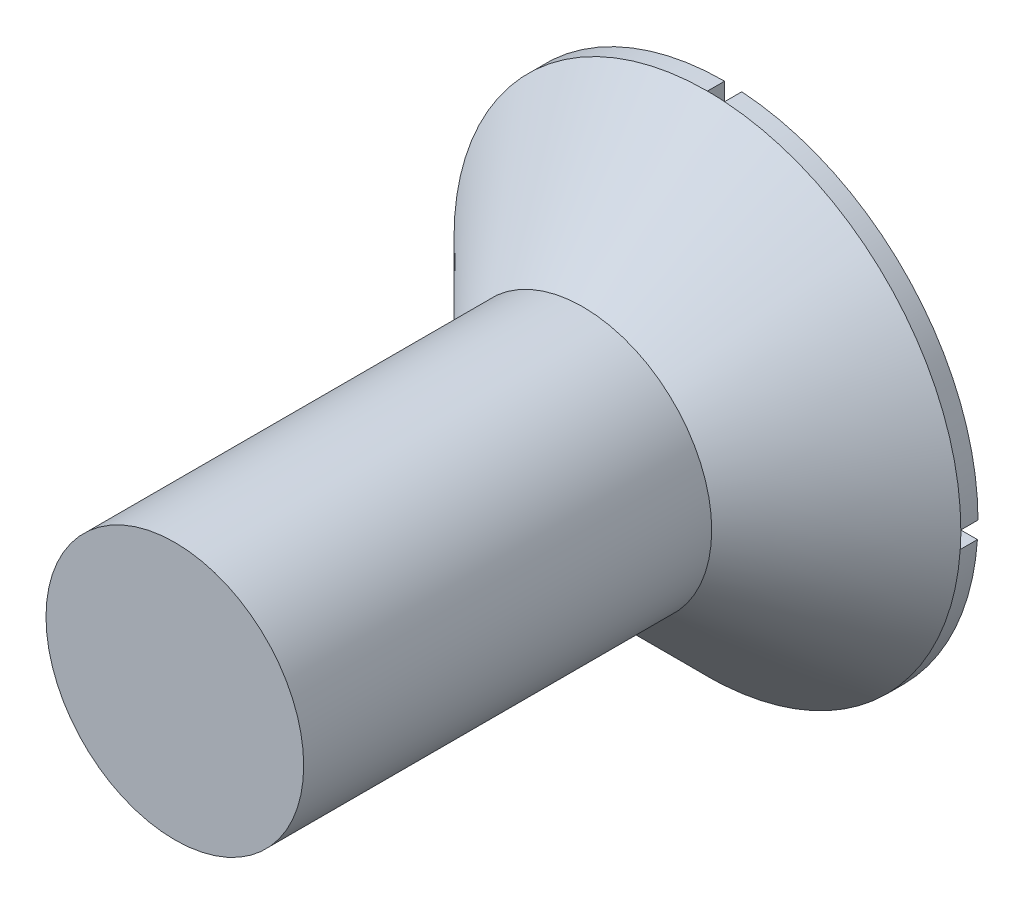
ISO-10303-21;
HEADER;
FILE_DESCRIPTION(('STEP AP214'),'2;1');
FILE_NAME('part.step','',(''),(''),'','','');
FILE_SCHEMA(('AUTOMOTIVE_DESIGN { 1 0 10303 214 1 1 1 1 }'));
ENDSEC;
DATA;
#1=APPLICATION_CONTEXT('core data for automotive mechanical design processes');
#2=APPLICATION_PROTOCOL_DEFINITION('international standard','automotive_design',2000,#1);
#3=PRODUCT_CONTEXT('',#1,'mechanical');
#4=PRODUCT('Part','Part','',(#3));
#5=PRODUCT_RELATED_PRODUCT_CATEGORY('part','',(#4));
#6=PRODUCT_DEFINITION_FORMATION('','',#4);
#7=PRODUCT_DEFINITION_CONTEXT('part definition',#1,'design');
#8=PRODUCT_DEFINITION('design','',#6,#7);
#9=PRODUCT_DEFINITION_SHAPE('','',#8);
#10=(LENGTH_UNIT() NAMED_UNIT(*) SI_UNIT(.MILLI.,.METRE.));
#11=(NAMED_UNIT(*) PLANE_ANGLE_UNIT() SI_UNIT($,.RADIAN.));
#12=(NAMED_UNIT(*) SI_UNIT($,.STERADIAN.) SOLID_ANGLE_UNIT());
#13=UNCERTAINTY_MEASURE_WITH_UNIT(LENGTH_MEASURE(1.E-05),#10,'distance_accuracy_value','');
#14=(GEOMETRIC_REPRESENTATION_CONTEXT(3) GLOBAL_UNCERTAINTY_ASSIGNED_CONTEXT((#13)) GLOBAL_UNIT_ASSIGNED_CONTEXT((#10,
#11,#12)) REPRESENTATION_CONTEXT('',''));
#15=CARTESIAN_POINT('',(0.,0.,0.));
#16=DIRECTION('',(0.,0.,1.));
#17=DIRECTION('',(1.,0.,0.));
#18=AXIS2_PLACEMENT_3D('',#15,#16,#17);
#19=CARTESIAN_POINT('',(0.,0.,-2.4));
#20=DIRECTION('',(0.,0.,1.));
#21=DIRECTION('',(1.,0.,0.));
#22=AXIS2_PLACEMENT_3D('',#19,#20,#21);
#23=CYLINDRICAL_SURFACE('',#22,2.95);
#24=DIRECTION('',(0.,0.,-1.));
#25=VECTOR('',#24,1.);
#26=CARTESIAN_POINT('',(0.,2.95,-2.2));
#27=LINE('',#26,#25);
#28=CARTESIAN_POINT('',(0.,2.95,-2.20000000000004));
#29=VERTEX_POINT('',#28);
#30=CARTESIAN_POINT('',(0.,2.95,-2.4));
#31=VERTEX_POINT('',#30);
#32=EDGE_CURVE('E197',#29,#31,#27,.T.);
#33=ORIENTED_EDGE('',*,*,#32,.T.);
#34=CARTESIAN_POINT('',(0.,0.,-2.4));
#35=DIRECTION('',(0.,0.,-1.));
#36=DIRECTION('',(-1.,0.,0.));
#37=AXIS2_PLACEMENT_3D('',#34,#35,#36);
#38=CIRCLE('',#37,2.95);
#39=CARTESIAN_POINT('',(-2.95,0.,-2.4));
#40=VERTEX_POINT('',#39);
#41=EDGE_CURVE('E174',#40,#31,#38,.T.);
#42=ORIENTED_EDGE('',*,*,#41,.F.);
#43=DIRECTION('',(0.,0.,-1.));
#44=VECTOR('',#43,1.);
#45=CARTESIAN_POINT('',(-2.95,0.,-2.2));
#46=LINE('',#45,#44);
#47=CARTESIAN_POINT('',(-2.95,0.,-2.2));
#48=VERTEX_POINT('',#47);
#49=EDGE_CURVE('E163',#48,#40,#46,.T.);
#50=ORIENTED_EDGE('',*,*,#49,.F.);
#51=CARTESIAN_POINT('',(0.,0.,-2.20000000000004));
#52=DIRECTION('',(0.,0.,-1.));
#53=DIRECTION('',(-1.,0.,0.));
#54=AXIS2_PLACEMENT_3D('',#51,#52,#53);
#55=CIRCLE('',#54,2.95);
#56=EDGE_CURVE('E65',#48,#29,#55,.T.);
#57=ORIENTED_EDGE('',*,*,#56,.T.);
#58=EDGE_LOOP('',(#33,#42,#50,#57));
#59=FACE_BOUND('',#58,.T.);
#60=ADVANCED_FACE('F57',(#59),#23,.T.);
#61=CARTESIAN_POINT('',(2.94321253055225,-0.2,-2.2));
#62=VERTEX_POINT('',#61);
#63=CARTESIAN_POINT('',(0.2,-2.94321253055225,-2.2));
#64=VERTEX_POINT('',#63);
#65=EDGE_CURVE('E254',#62,#64,#55,.T.);
#66=ORIENTED_EDGE('',*,*,#65,.T.);
#67=DIRECTION('',(0.,0.,1.));
#68=VECTOR('',#67,1.);
#69=CARTESIAN_POINT('',(0.2,-2.94321253055229,-2.4));
#70=LINE('',#69,#68);
#71=CARTESIAN_POINT('',(0.2,-2.94321253055229,-2.4));
#72=VERTEX_POINT('',#71);
#73=EDGE_CURVE('E188',#64,#72,#70,.F.);
#74=ORIENTED_EDGE('',*,*,#73,.T.);
#75=CARTESIAN_POINT('',(2.94321253055229,-0.2,-2.4));
#76=VERTEX_POINT('',#75);
#77=EDGE_CURVE('E252',#76,#72,#38,.T.);
#78=ORIENTED_EDGE('',*,*,#77,.F.);
#79=DIRECTION('',(0.,0.,1.));
#80=VECTOR('',#79,1.);
#81=CARTESIAN_POINT('',(2.94321253055229,-0.2,-2.4));
#82=LINE('',#81,#80);
#83=EDGE_CURVE('E194',#76,#62,#82,.T.);
#84=ORIENTED_EDGE('',*,*,#83,.T.);
#85=EDGE_LOOP('',(#66,#74,#78,#84));
#86=FACE_BOUND('',#85,.T.);
#87=ADVANCED_FACE('F251',(#86),#23,.T.);
#88=CARTESIAN_POINT('',(0.2,2.94321253055229,-2.4));
#89=VERTEX_POINT('',#88);
#90=CARTESIAN_POINT('',(2.95,0.,-2.4));
#91=VERTEX_POINT('',#90);
#92=EDGE_CURVE('E185',#89,#91,#38,.T.);
#93=ORIENTED_EDGE('',*,*,#92,.F.);
#94=DIRECTION('',(0.,0.,1.));
#95=VECTOR('',#94,1.);
#96=CARTESIAN_POINT('',(0.2,2.94321253055229,-2.4));
#97=LINE('',#96,#95);
#98=CARTESIAN_POINT('',(0.2,2.94321253055225,-2.2));
#99=VERTEX_POINT('',#98);
#100=EDGE_CURVE('E80',#89,#99,#97,.T.);
#101=ORIENTED_EDGE('',*,*,#100,.T.);
#102=CARTESIAN_POINT('',(2.95,0.,-2.2));
#103=VERTEX_POINT('',#102);
#104=EDGE_CURVE('E180',#99,#103,#55,.T.);
#105=ORIENTED_EDGE('',*,*,#104,.T.);
#106=DIRECTION('',(0.,0.,-1.));
#107=VECTOR('',#106,1.);
#108=CARTESIAN_POINT('',(2.95,0.,-2.2));
#109=LINE('',#108,#107);
#110=EDGE_CURVE('E175',#103,#91,#109,.T.);
#111=ORIENTED_EDGE('',*,*,#110,.T.);
#112=EDGE_LOOP('',(#93,#101,#105,#111));
#113=FACE_BOUND('',#112,.T.);
#114=ADVANCED_FACE('F277',(#113),#23,.T.);
#115=CARTESIAN_POINT('',(0.,0.,-2.4));
#116=DIRECTION('',(0.,0.,-1.));
#117=DIRECTION('',(-1.,0.,0.));
#118=AXIS2_PLACEMENT_3D('',#115,#116,#117);
#119=PLANE('',#118);
#120=ORIENTED_EDGE('',*,*,#41,.T.);
#121=DIRECTION('',(0.,-1.,0.));
#122=VECTOR('',#121,1.);
#123=CARTESIAN_POINT('',(0.,2.95,-2.4));
#124=LINE('',#123,#122);
#125=CARTESIAN_POINT('',(0.,0.,-2.4));
#126=VERTEX_POINT('',#125);
#127=EDGE_CURVE('E201',#31,#126,#124,.T.);
#128=ORIENTED_EDGE('',*,*,#127,.T.);
#129=DIRECTION('',(-1.,0.,0.));
#130=VECTOR('',#129,1.);
#131=CARTESIAN_POINT('',(2.95,0.,-2.4));
#132=LINE('',#131,#130);
#133=EDGE_CURVE('E228',#126,#40,#132,.T.);
#134=ORIENTED_EDGE('',*,*,#133,.T.);
#135=EDGE_LOOP('',(#120,#128,#134));
#136=FACE_BOUND('',#135,.T.);
#137=ADVANCED_FACE('F304',(#136),#119,.T.);
#138=DIRECTION('',(-1.,0.,0.));
#139=VECTOR('',#138,1.);
#140=CARTESIAN_POINT('',(2.95,-0.2,-2.4));
#141=LINE('',#140,#139);
#142=CARTESIAN_POINT('',(0.,-0.2,-2.4));
#143=VERTEX_POINT('',#142);
#144=CARTESIAN_POINT('',(-2.94321253055229,-0.2,-2.4));
#145=VERTEX_POINT('',#144);
#146=EDGE_CURVE('E230',#143,#145,#141,.T.);
#147=ORIENTED_EDGE('',*,*,#146,.F.);
#148=CARTESIAN_POINT('',(0.,-2.95,-2.4));
#149=VERTEX_POINT('',#148);
#150=EDGE_CURVE('E205',#143,#149,#124,.T.);
#151=ORIENTED_EDGE('',*,*,#150,.T.);
#152=EDGE_CURVE('E186',#149,#145,#38,.T.);
#153=ORIENTED_EDGE('',*,*,#152,.T.);
#154=EDGE_LOOP('',(#147,#151,#153));
#155=FACE_BOUND('',#154,.T.);
#156=ADVANCED_FACE('F263',(#155),#119,.T.);
#157=DIRECTION('',(0.,1.,0.));
#158=VECTOR('',#157,1.);
#159=CARTESIAN_POINT('',(0.2,2.95,-2.4));
#160=LINE('',#159,#158);
#161=CARTESIAN_POINT('',(0.2,-0.2,-2.4));
#162=VERTEX_POINT('',#161);
#163=EDGE_CURVE('E208',#162,#72,#160,.F.);
#164=ORIENTED_EDGE('',*,*,#163,.F.);
#165=EDGE_CURVE('E229',#76,#162,#141,.T.);
#166=ORIENTED_EDGE('',*,*,#165,.F.);
#167=ORIENTED_EDGE('',*,*,#77,.T.);
#168=EDGE_LOOP('',(#164,#166,#167));
#169=FACE_BOUND('',#168,.T.);
#170=ADVANCED_FACE('F256',(#169),#119,.T.);
#171=CARTESIAN_POINT('',(0.,0.,4.));
#172=DIRECTION('',(0.,0.,-1.));
#173=DIRECTION('',(-1.,0.,0.));
#174=AXIS2_PLACEMENT_3D('',#171,#172,#173);
#175=CYLINDRICAL_SURFACE('',#174,1.5);
#176=CARTESIAN_POINT('',(0.,0.,-0.750000000000023));
#177=DIRECTION('',(0.,0.,-1.));
#178=DIRECTION('',(-1.,0.,0.));
#179=AXIS2_PLACEMENT_3D('',#176,#177,#178);
#180=CIRCLE('',#179,1.5);
#181=CARTESIAN_POINT('',(-1.5,0.,-0.750000000000023));
#182=VERTEX_POINT('',#181);
#183=EDGE_CURVE('E12',#182,#182,#180,.F.);
#184=ORIENTED_EDGE('',*,*,#183,.T.);
#185=EDGE_LOOP('',(#184));
#186=FACE_BOUND('',#185,.T.);
#187=CARTESIAN_POINT('',(0.,0.,4.));
#188=DIRECTION('',(0.,0.,1.));
#189=DIRECTION('',(1.,0.,0.));
#190=AXIS2_PLACEMENT_3D('',#187,#188,#189);
#191=CIRCLE('',#190,1.5);
#192=CARTESIAN_POINT('',(1.5,0.,4.));
#193=VERTEX_POINT('',#192);
#194=EDGE_CURVE('E158',#193,#193,#191,.T.);
#195=ORIENTED_EDGE('',*,*,#194,.F.);
#196=EDGE_LOOP('',(#195));
#197=FACE_BOUND('',#196,.T.);
#198=ADVANCED_FACE('F306',(#186,#197),#175,.T.);
#199=CARTESIAN_POINT('',(0.,0.,4.));
#200=DIRECTION('',(0.,0.,1.));
#201=DIRECTION('',(1.,0.,0.));
#202=AXIS2_PLACEMENT_3D('',#199,#200,#201);
#203=PLANE('',#202);
#204=ORIENTED_EDGE('',*,*,#194,.T.);
#205=EDGE_LOOP('',(#204));
#206=FACE_BOUND('',#205,.T.);
#207=ADVANCED_FACE('F299',(#206),#203,.T.);
#208=ORIENTED_EDGE('',*,*,#152,.F.);
#209=DIRECTION('',(0.,0.,-1.));
#210=VECTOR('',#209,1.);
#211=CARTESIAN_POINT('',(0.,-2.95,-2.2));
#212=LINE('',#211,#210);
#213=CARTESIAN_POINT('',(0.,-2.95,-2.2));
#214=VERTEX_POINT('',#213);
#215=EDGE_CURVE('E198',#214,#149,#212,.T.);
#216=ORIENTED_EDGE('',*,*,#215,.F.);
#217=CARTESIAN_POINT('',(-2.94321253055225,-0.2,-2.2));
#218=VERTEX_POINT('',#217);
#219=EDGE_CURVE('E157',#214,#218,#55,.T.);
#220=ORIENTED_EDGE('',*,*,#219,.T.);
#221=DIRECTION('',(0.,0.,1.));
#222=VECTOR('',#221,1.);
#223=CARTESIAN_POINT('',(-2.94321253055229,-0.2,-2.4));
#224=LINE('',#223,#222);
#225=EDGE_CURVE('E191',#218,#145,#224,.F.);
#226=ORIENTED_EDGE('',*,*,#225,.T.);
#227=EDGE_LOOP('',(#208,#216,#220,#226));
#228=FACE_BOUND('',#227,.T.);
#229=ADVANCED_FACE('F266',(#228),#23,.T.);
#230=CARTESIAN_POINT('',(0.2,0.,-2.4));
#231=VERTEX_POINT('',#230);
#232=EDGE_CURVE('E206',#89,#231,#160,.F.);
#233=ORIENTED_EDGE('',*,*,#232,.F.);
#234=ORIENTED_EDGE('',*,*,#92,.T.);
#235=EDGE_CURVE('E225',#91,#231,#132,.T.);
#236=ORIENTED_EDGE('',*,*,#235,.T.);
#237=EDGE_LOOP('',(#233,#234,#236));
#238=FACE_BOUND('',#237,.T.);
#239=ADVANCED_FACE('F279',(#238),#119,.T.);
#240=CARTESIAN_POINT('',(0.,0.,-2.20000000000004));
#241=DIRECTION('',(0.,0.,-1.));
#242=DIRECTION('',(-1.,0.,0.));
#243=AXIS2_PLACEMENT_3D('',#240,#241,#242);
#244=CONICAL_SURFACE('',#243,2.95,0.785398163397443);
#245=ORIENTED_EDGE('',*,*,#183,.F.);
#246=EDGE_LOOP('',(#245));
#247=FACE_BOUND('',#246,.T.);
#248=ORIENTED_EDGE('',*,*,#56,.F.);
#249=EDGE_CURVE('E147',#218,#48,#55,.T.);
#250=ORIENTED_EDGE('',*,*,#249,.F.);
#251=ORIENTED_EDGE('',*,*,#219,.F.);
#252=EDGE_CURVE('E273',#64,#214,#55,.T.);
#253=ORIENTED_EDGE('',*,*,#252,.F.);
#254=ORIENTED_EDGE('',*,*,#65,.F.);
#255=EDGE_CURVE('E240',#103,#62,#55,.T.);
#256=ORIENTED_EDGE('',*,*,#255,.F.);
#257=ORIENTED_EDGE('',*,*,#104,.F.);
#258=EDGE_CURVE('E179',#29,#99,#55,.T.);
#259=ORIENTED_EDGE('',*,*,#258,.F.);
#260=EDGE_LOOP('',(#248,#250,#251,#253,#254,#256,#257,#259));
#261=FACE_BOUND('',#260,.T.);
#262=ADVANCED_FACE('F59',(#247,#261),#244,.T.);
#263=CARTESIAN_POINT('',(0.2,2.95,-2.2));
#264=DIRECTION('',(1.,0.,0.));
#265=DIRECTION('',(0.,0.,-1.));
#266=AXIS2_PLACEMENT_3D('',#263,#264,#265);
#267=PLANE('',#266);
#268=ORIENTED_EDGE('',*,*,#232,.T.);
#269=DIRECTION('',(0.,0.,-1.));
#270=VECTOR('',#269,1.);
#271=CARTESIAN_POINT('',(0.2,0.,-2.2));
#272=LINE('',#271,#270);
#273=CARTESIAN_POINT('',(0.2,0.,-2.2));
#274=VERTEX_POINT('',#273);
#275=EDGE_CURVE('E219',#274,#231,#272,.T.);
#276=ORIENTED_EDGE('',*,*,#275,.F.);
#277=DIRECTION('',(0.,1.,0.));
#278=VECTOR('',#277,1.);
#279=CARTESIAN_POINT('',(0.2,2.95,-2.2));
#280=LINE('',#279,#278);
#281=EDGE_CURVE('E211',#99,#274,#280,.F.);
#282=ORIENTED_EDGE('',*,*,#281,.F.);
#283=ORIENTED_EDGE('',*,*,#100,.F.);
#284=EDGE_LOOP('',(#268,#276,#282,#283));
#285=FACE_BOUND('',#284,.T.);
#286=ADVANCED_FACE('F281',(#285),#267,.F.);
#287=CARTESIAN_POINT('',(0.2,-0.2,-2.2));
#288=VERTEX_POINT('',#287);
#289=EDGE_CURVE('E204',#288,#64,#280,.F.);
#290=ORIENTED_EDGE('',*,*,#289,.F.);
#291=DIRECTION('',(0.,0.,-1.));
#292=VECTOR('',#291,1.);
#293=CARTESIAN_POINT('',(0.2,-0.2,-2.2));
#294=LINE('',#293,#292);
#295=EDGE_CURVE('E213',#288,#162,#294,.T.);
#296=ORIENTED_EDGE('',*,*,#295,.T.);
#297=ORIENTED_EDGE('',*,*,#163,.T.);
#298=ORIENTED_EDGE('',*,*,#73,.F.);
#299=EDGE_LOOP('',(#290,#296,#297,#298));
#300=FACE_BOUND('',#299,.T.);
#301=ADVANCED_FACE('F246',(#300),#267,.F.);
#302=CARTESIAN_POINT('',(2.95,-0.2,-2.2));
#303=DIRECTION('',(0.,-1.,0.));
#304=DIRECTION('',(0.,0.,-1.));
#305=AXIS2_PLACEMENT_3D('',#302,#303,#304);
#306=PLANE('',#305);
#307=DIRECTION('',(-1.,0.,0.));
#308=VECTOR('',#307,1.);
#309=CARTESIAN_POINT('',(2.95,-0.2,-2.2));
#310=LINE('',#309,#308);
#311=CARTESIAN_POINT('',(0.,-0.2,-2.2));
#312=VERTEX_POINT('',#311);
#313=EDGE_CURVE('E152',#312,#218,#310,.T.);
#314=ORIENTED_EDGE('',*,*,#313,.F.);
#315=DIRECTION('',(0.,0.,-1.));
#316=VECTOR('',#315,1.);
#317=CARTESIAN_POINT('',(0.,-0.2,-2.2));
#318=LINE('',#317,#316);
#319=EDGE_CURVE('E216',#312,#143,#318,.T.);
#320=ORIENTED_EDGE('',*,*,#319,.T.);
#321=ORIENTED_EDGE('',*,*,#146,.T.);
#322=ORIENTED_EDGE('',*,*,#225,.F.);
#323=EDGE_LOOP('',(#314,#320,#321,#322));
#324=FACE_BOUND('',#323,.T.);
#325=ADVANCED_FACE('F268',(#324),#306,.F.);
#326=ORIENTED_EDGE('',*,*,#165,.T.);
#327=ORIENTED_EDGE('',*,*,#295,.F.);
#328=EDGE_CURVE('E167',#62,#288,#310,.T.);
#329=ORIENTED_EDGE('',*,*,#328,.F.);
#330=ORIENTED_EDGE('',*,*,#83,.F.);
#331=EDGE_LOOP('',(#326,#327,#329,#330));
#332=FACE_BOUND('',#331,.T.);
#333=ADVANCED_FACE('F242',(#332),#306,.F.);
#334=CARTESIAN_POINT('',(0.,2.95,-2.2));
#335=DIRECTION('',(1.,0.,0.));
#336=DIRECTION('',(0.,0.,-1.));
#337=AXIS2_PLACEMENT_3D('',#334,#335,#336);
#338=PLANE('',#337);
#339=DIRECTION('',(0.,0.,-1.));
#340=VECTOR('',#339,1.);
#341=CARTESIAN_POINT('',(0.,0.,-2.2));
#342=LINE('',#341,#340);
#343=CARTESIAN_POINT('',(0.,0.,-2.2));
#344=VERTEX_POINT('',#343);
#345=EDGE_CURVE('E165',#344,#126,#342,.T.);
#346=ORIENTED_EDGE('',*,*,#345,.T.);
#347=ORIENTED_EDGE('',*,*,#127,.F.);
#348=ORIENTED_EDGE('',*,*,#32,.F.);
#349=DIRECTION('',(0.,-1.,0.));
#350=VECTOR('',#349,1.);
#351=CARTESIAN_POINT('',(0.,2.95,-2.2));
#352=LINE('',#351,#350);
#353=EDGE_CURVE('E72',#29,#344,#352,.T.);
#354=ORIENTED_EDGE('',*,*,#353,.T.);
#355=EDGE_LOOP('',(#346,#347,#348,#354));
#356=FACE_BOUND('',#355,.T.);
#357=ADVANCED_FACE('F321',(#356),#338,.T.);
#358=EDGE_CURVE('E210',#312,#214,#352,.T.);
#359=ORIENTED_EDGE('',*,*,#358,.T.);
#360=ORIENTED_EDGE('',*,*,#215,.T.);
#361=ORIENTED_EDGE('',*,*,#150,.F.);
#362=ORIENTED_EDGE('',*,*,#319,.F.);
#363=EDGE_LOOP('',(#359,#360,#361,#362));
#364=FACE_BOUND('',#363,.T.);
#365=ADVANCED_FACE('F272',(#364),#338,.T.);
#366=CARTESIAN_POINT('',(0.,0.,-2.2));
#367=DIRECTION('',(0.,0.,-1.));
#368=DIRECTION('',(-1.,0.,0.));
#369=AXIS2_PLACEMENT_3D('',#366,#367,#368);
#370=PLANE('',#369);
#371=DIRECTION('',(-1.,0.,0.));
#372=VECTOR('',#371,1.);
#373=CARTESIAN_POINT('',(2.95,0.,-2.2));
#374=LINE('',#373,#372);
#375=EDGE_CURVE('E150',#344,#48,#374,.T.);
#376=ORIENTED_EDGE('',*,*,#375,.F.);
#377=ORIENTED_EDGE('',*,*,#353,.F.);
#378=ORIENTED_EDGE('',*,*,#258,.T.);
#379=ORIENTED_EDGE('',*,*,#281,.T.);
#380=EDGE_CURVE('E166',#103,#274,#374,.T.);
#381=ORIENTED_EDGE('',*,*,#380,.F.);
#382=ORIENTED_EDGE('',*,*,#255,.T.);
#383=ORIENTED_EDGE('',*,*,#328,.T.);
#384=ORIENTED_EDGE('',*,*,#289,.T.);
#385=ORIENTED_EDGE('',*,*,#252,.T.);
#386=ORIENTED_EDGE('',*,*,#358,.F.);
#387=ORIENTED_EDGE('',*,*,#313,.T.);
#388=ORIENTED_EDGE('',*,*,#249,.T.);
#389=EDGE_LOOP('',(#376,#377,#378,#379,#381,#382,#383,#384,#385,#386,#387,#388));
#390=FACE_BOUND('',#389,.T.);
#391=ADVANCED_FACE('F149',(#390),#370,.T.);
#392=CARTESIAN_POINT('',(2.95,0.,-2.2));
#393=DIRECTION('',(0.,-1.,0.));
#394=DIRECTION('',(0.,0.,-1.));
#395=AXIS2_PLACEMENT_3D('',#392,#393,#394);
#396=PLANE('',#395);
#397=ORIENTED_EDGE('',*,*,#375,.T.);
#398=ORIENTED_EDGE('',*,*,#49,.T.);
#399=ORIENTED_EDGE('',*,*,#133,.F.);
#400=ORIENTED_EDGE('',*,*,#345,.F.);
#401=EDGE_LOOP('',(#397,#398,#399,#400));
#402=FACE_BOUND('',#401,.T.);
#403=ADVANCED_FACE('F161',(#402),#396,.T.);
#404=ORIENTED_EDGE('',*,*,#275,.T.);
#405=ORIENTED_EDGE('',*,*,#235,.F.);
#406=ORIENTED_EDGE('',*,*,#110,.F.);
#407=ORIENTED_EDGE('',*,*,#380,.T.);
#408=EDGE_LOOP('',(#404,#405,#406,#407));
#409=FACE_BOUND('',#408,.T.);
#410=ADVANCED_FACE('F283',(#409),#396,.T.);
#411=CLOSED_SHELL('',(#60,#87,#114,#137,#156,#170,#198,#207,#229,#239,#262,#286,#301,#325,#333,
#357,#365,#391,#403,#410));
#412=MANIFOLD_SOLID_BREP('B2',#411);
#413=ADVANCED_BREP_SHAPE_REPRESENTATION('',(#18,#412),#14);
#414=SHAPE_DEFINITION_REPRESENTATION(#9,#413);
ENDSEC;
END-ISO-10303-21;
